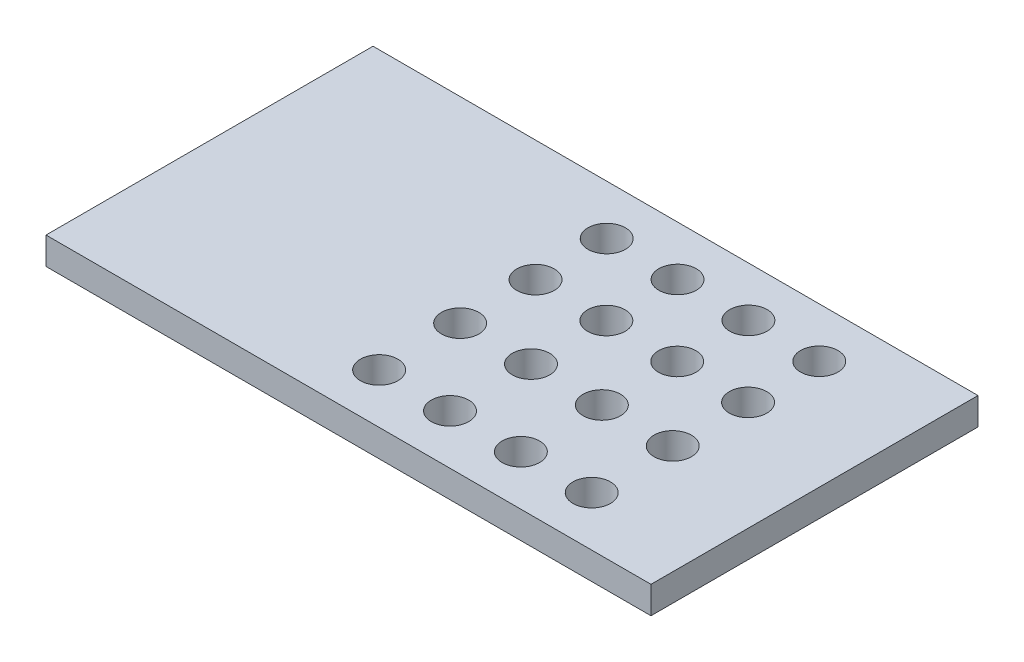
ISO-10303-21;
HEADER;
FILE_DESCRIPTION(('STEP AP214'),'2;1');
FILE_NAME('part.step','',(''),(''),'','','');
FILE_SCHEMA(('AUTOMOTIVE_DESIGN { 1 0 10303 214 1 1 1 1 }'));
ENDSEC;
DATA;
#1=APPLICATION_CONTEXT('core data for automotive mechanical design processes');
#2=APPLICATION_PROTOCOL_DEFINITION('international standard','automotive_design',2000,#1);
#3=PRODUCT_CONTEXT('',#1,'mechanical');
#4=PRODUCT('Part','Part','',(#3));
#5=PRODUCT_RELATED_PRODUCT_CATEGORY('part','',(#4));
#6=PRODUCT_DEFINITION_FORMATION('','',#4);
#7=PRODUCT_DEFINITION_CONTEXT('part definition',#1,'design');
#8=PRODUCT_DEFINITION('design','',#6,#7);
#9=PRODUCT_DEFINITION_SHAPE('','',#8);
#10=(LENGTH_UNIT() NAMED_UNIT(*) SI_UNIT(.MILLI.,.METRE.));
#11=(NAMED_UNIT(*) PLANE_ANGLE_UNIT() SI_UNIT($,.RADIAN.));
#12=(NAMED_UNIT(*) SI_UNIT($,.STERADIAN.) SOLID_ANGLE_UNIT());
#13=UNCERTAINTY_MEASURE_WITH_UNIT(LENGTH_MEASURE(1.E-05),#10,'distance_accuracy_value','');
#14=(GEOMETRIC_REPRESENTATION_CONTEXT(3) GLOBAL_UNCERTAINTY_ASSIGNED_CONTEXT((#13)) GLOBAL_UNIT_ASSIGNED_CONTEXT((#10,
#11,#12)) REPRESENTATION_CONTEXT('',''));
#15=CARTESIAN_POINT('',(0.,0.,0.));
#16=DIRECTION('',(0.,0.,1.));
#17=DIRECTION('',(1.,0.,0.));
#18=AXIS2_PLACEMENT_3D('',#15,#16,#17);
#19=CARTESIAN_POINT('',(0.,6.35,0.));
#20=DIRECTION('',(0.,1.,0.));
#21=DIRECTION('',(0.,0.,1.));
#22=AXIS2_PLACEMENT_3D('',#19,#20,#21);
#23=PLANE('',#22);
#24=CARTESIAN_POINT('',(-8.255,6.35,27.65552));
#25=DIRECTION('',(0.,1.,0.));
#26=DIRECTION('',(0.,0.,1.));
#27=AXIS2_PLACEMENT_3D('',#24,#25,#26);
#28=CIRCLE('',#27,4.365625);
#29=CARTESIAN_POINT('',(-8.255,6.35,32.021145));
#30=VERTEX_POINT('',#29);
#31=EDGE_CURVE('E195',#30,#30,#28,.T.);
#32=ORIENTED_EDGE('',*,*,#31,.F.);
#33=EDGE_LOOP('',(#32));
#34=FACE_BOUND('',#33,.T.);
#35=CARTESIAN_POINT('',(24.765,6.35,27.65552));
#36=DIRECTION('',(0.,1.,0.));
#37=DIRECTION('',(0.,0.,1.));
#38=AXIS2_PLACEMENT_3D('',#35,#36,#37);
#39=CIRCLE('',#38,4.365625);
#40=CARTESIAN_POINT('',(24.765,6.35,32.021145));
#41=VERTEX_POINT('',#40);
#42=EDGE_CURVE('E183',#41,#41,#39,.T.);
#43=ORIENTED_EDGE('',*,*,#42,.F.);
#44=EDGE_LOOP('',(#43));
#45=FACE_BOUND('',#44,.T.);
#46=CARTESIAN_POINT('',(8.255,6.35,8.78078));
#47=DIRECTION('',(0.,1.,0.));
#48=DIRECTION('',(0.,0.,1.));
#49=AXIS2_PLACEMENT_3D('',#46,#47,#48);
#50=CIRCLE('',#49,4.365625);
#51=CARTESIAN_POINT('',(8.255,6.35,13.146405));
#52=VERTEX_POINT('',#51);
#53=EDGE_CURVE('E171',#52,#52,#50,.T.);
#54=ORIENTED_EDGE('',*,*,#53,.F.);
#55=EDGE_LOOP('',(#54));
#56=FACE_BOUND('',#55,.T.);
#57=CARTESIAN_POINT('',(-24.765,6.35,8.78078));
#58=DIRECTION('',(0.,1.,0.));
#59=DIRECTION('',(0.,0.,1.));
#60=AXIS2_PLACEMENT_3D('',#57,#58,#59);
#61=CIRCLE('',#60,4.365625);
#62=CARTESIAN_POINT('',(-24.765,6.35,13.146405));
#63=VERTEX_POINT('',#62);
#64=EDGE_CURVE('E159',#63,#63,#61,.T.);
#65=ORIENTED_EDGE('',*,*,#64,.F.);
#66=EDGE_LOOP('',(#65));
#67=FACE_BOUND('',#66,.T.);
#68=CARTESIAN_POINT('',(-8.255,6.35,-8.78078));
#69=DIRECTION('',(0.,1.,0.));
#70=DIRECTION('',(0.,0.,1.));
#71=AXIS2_PLACEMENT_3D('',#68,#69,#70);
#72=CIRCLE('',#71,4.365625);
#73=CARTESIAN_POINT('',(-8.255,6.35,-4.415155));
#74=VERTEX_POINT('',#73);
#75=EDGE_CURVE('E147',#74,#74,#72,.T.);
#76=ORIENTED_EDGE('',*,*,#75,.F.);
#77=EDGE_LOOP('',(#76));
#78=FACE_BOUND('',#77,.T.);
#79=CARTESIAN_POINT('',(24.765,6.35,-8.78078000000001));
#80=DIRECTION('',(0.,1.,0.));
#81=DIRECTION('',(0.,0.,1.));
#82=AXIS2_PLACEMENT_3D('',#79,#80,#81);
#83=CIRCLE('',#82,4.365625);
#84=CARTESIAN_POINT('',(24.765,6.35,-4.41515500000001));
#85=VERTEX_POINT('',#84);
#86=EDGE_CURVE('E135',#85,#85,#83,.T.);
#87=ORIENTED_EDGE('',*,*,#86,.F.);
#88=EDGE_LOOP('',(#87));
#89=FACE_BOUND('',#88,.T.);
#90=CARTESIAN_POINT('',(8.255,6.35,-25.36698));
#91=DIRECTION('',(0.,1.,0.));
#92=DIRECTION('',(0.,0.,1.));
#93=AXIS2_PLACEMENT_3D('',#90,#91,#92);
#94=CIRCLE('',#93,4.365625);
#95=CARTESIAN_POINT('',(8.255,6.35,-21.001355));
#96=VERTEX_POINT('',#95);
#97=EDGE_CURVE('E123',#96,#96,#94,.T.);
#98=ORIENTED_EDGE('',*,*,#97,.F.);
#99=EDGE_LOOP('',(#98));
#100=FACE_BOUND('',#99,.T.);
#101=CARTESIAN_POINT('',(-24.765,6.35,-25.36698));
#102=DIRECTION('',(0.,1.,0.));
#103=DIRECTION('',(0.,0.,1.));
#104=AXIS2_PLACEMENT_3D('',#101,#102,#103);
#105=CIRCLE('',#104,4.365625);
#106=CARTESIAN_POINT('',(-24.765,6.35,-21.001355));
#107=VERTEX_POINT('',#106);
#108=EDGE_CURVE('E102',#107,#107,#105,.T.);
#109=ORIENTED_EDGE('',*,*,#108,.F.);
#110=EDGE_LOOP('',(#109));
#111=FACE_BOUND('',#110,.T.);
#112=DIRECTION('',(0.,0.,1.));
#113=VECTOR('',#112,1.);
#114=CARTESIAN_POINT('',(-90.805,6.35,39.24427));
#115=LINE('',#114,#113);
#116=CARTESIAN_POINT('',(-90.805,6.35,-36.95573));
#117=VERTEX_POINT('',#116);
#118=CARTESIAN_POINT('',(-90.805,6.35,39.24427));
#119=VERTEX_POINT('',#118);
#120=EDGE_CURVE('E87',#117,#119,#115,.T.);
#121=ORIENTED_EDGE('',*,*,#120,.T.);
#122=DIRECTION('',(1.,0.,0.));
#123=VECTOR('',#122,1.);
#124=CARTESIAN_POINT('',(50.165,6.35,39.24427));
#125=LINE('',#124,#123);
#126=CARTESIAN_POINT('',(50.165,6.35,39.24427));
#127=VERTEX_POINT('',#126);
#128=EDGE_CURVE('E82',#119,#127,#125,.T.);
#129=ORIENTED_EDGE('',*,*,#128,.T.);
#130=DIRECTION('',(0.,0.,-1.));
#131=VECTOR('',#130,1.);
#132=CARTESIAN_POINT('',(50.165,6.35,39.24427));
#133=LINE('',#132,#131);
#134=CARTESIAN_POINT('',(50.165,6.35,-36.95573));
#135=VERTEX_POINT('',#134);
#136=EDGE_CURVE('E85',#127,#135,#133,.T.);
#137=ORIENTED_EDGE('',*,*,#136,.T.);
#138=DIRECTION('',(-1.,0.,0.));
#139=VECTOR('',#138,1.);
#140=CARTESIAN_POINT('',(50.165,6.35,-36.95573));
#141=LINE('',#140,#139);
#142=EDGE_CURVE('E52',#135,#117,#141,.T.);
#143=ORIENTED_EDGE('',*,*,#142,.T.);
#144=EDGE_LOOP('',(#121,#129,#137,#143));
#145=FACE_BOUND('',#144,.T.);
#146=CARTESIAN_POINT('',(-8.25500000000001,6.35,-25.36698));
#147=DIRECTION('',(0.,1.,0.));
#148=DIRECTION('',(0.,0.,1.));
#149=AXIS2_PLACEMENT_3D('',#146,#147,#148);
#150=CIRCLE('',#149,4.365625);
#151=CARTESIAN_POINT('',(-8.25500000000001,6.35,-21.001355));
#152=VERTEX_POINT('',#151);
#153=EDGE_CURVE('E117',#152,#152,#150,.T.);
#154=ORIENTED_EDGE('',*,*,#153,.F.);
#155=EDGE_LOOP('',(#154));
#156=FACE_BOUND('',#155,.T.);
#157=CARTESIAN_POINT('',(24.765,6.35,-25.36698));
#158=DIRECTION('',(0.,1.,0.));
#159=DIRECTION('',(0.,0.,1.));
#160=AXIS2_PLACEMENT_3D('',#157,#158,#159);
#161=CIRCLE('',#160,4.365625);
#162=CARTESIAN_POINT('',(24.765,6.35,-21.001355));
#163=VERTEX_POINT('',#162);
#164=EDGE_CURVE('E129',#163,#163,#161,.T.);
#165=ORIENTED_EDGE('',*,*,#164,.F.);
#166=EDGE_LOOP('',(#165));
#167=FACE_BOUND('',#166,.T.);
#168=CARTESIAN_POINT('',(8.255,6.35,-8.78078));
#169=DIRECTION('',(0.,1.,0.));
#170=DIRECTION('',(0.,0.,1.));
#171=AXIS2_PLACEMENT_3D('',#168,#169,#170);
#172=CIRCLE('',#171,4.365625);
#173=CARTESIAN_POINT('',(8.255,6.35,-4.415155));
#174=VERTEX_POINT('',#173);
#175=EDGE_CURVE('E141',#174,#174,#172,.T.);
#176=ORIENTED_EDGE('',*,*,#175,.F.);
#177=EDGE_LOOP('',(#176));
#178=FACE_BOUND('',#177,.T.);
#179=CARTESIAN_POINT('',(-24.765,6.35,-8.78078));
#180=DIRECTION('',(0.,1.,0.));
#181=DIRECTION('',(0.,0.,1.));
#182=AXIS2_PLACEMENT_3D('',#179,#180,#181);
#183=CIRCLE('',#182,4.365625);
#184=CARTESIAN_POINT('',(-24.765,6.35,-4.415155));
#185=VERTEX_POINT('',#184);
#186=EDGE_CURVE('E153',#185,#185,#183,.T.);
#187=ORIENTED_EDGE('',*,*,#186,.F.);
#188=EDGE_LOOP('',(#187));
#189=FACE_BOUND('',#188,.T.);
#190=CARTESIAN_POINT('',(-8.25500000000001,6.35,8.78078));
#191=DIRECTION('',(0.,1.,0.));
#192=DIRECTION('',(0.,0.,1.));
#193=AXIS2_PLACEMENT_3D('',#190,#191,#192);
#194=CIRCLE('',#193,4.365625);
#195=CARTESIAN_POINT('',(-8.25500000000001,6.35,13.146405));
#196=VERTEX_POINT('',#195);
#197=EDGE_CURVE('E165',#196,#196,#194,.T.);
#198=ORIENTED_EDGE('',*,*,#197,.F.);
#199=EDGE_LOOP('',(#198));
#200=FACE_BOUND('',#199,.T.);
#201=CARTESIAN_POINT('',(24.765,6.35,8.78077999999999));
#202=DIRECTION('',(0.,1.,0.));
#203=DIRECTION('',(0.,0.,1.));
#204=AXIS2_PLACEMENT_3D('',#201,#202,#203);
#205=CIRCLE('',#204,4.365625);
#206=CARTESIAN_POINT('',(24.765,6.35,13.146405));
#207=VERTEX_POINT('',#206);
#208=EDGE_CURVE('E177',#207,#207,#205,.T.);
#209=ORIENTED_EDGE('',*,*,#208,.F.);
#210=EDGE_LOOP('',(#209));
#211=FACE_BOUND('',#210,.T.);
#212=CARTESIAN_POINT('',(8.255,6.35,27.65552));
#213=DIRECTION('',(0.,1.,0.));
#214=DIRECTION('',(0.,0.,1.));
#215=AXIS2_PLACEMENT_3D('',#212,#213,#214);
#216=CIRCLE('',#215,4.365625);
#217=CARTESIAN_POINT('',(8.255,6.35,32.021145));
#218=VERTEX_POINT('',#217);
#219=EDGE_CURVE('E189',#218,#218,#216,.T.);
#220=ORIENTED_EDGE('',*,*,#219,.F.);
#221=EDGE_LOOP('',(#220));
#222=FACE_BOUND('',#221,.T.);
#223=CARTESIAN_POINT('',(-24.765,6.35,27.65552));
#224=DIRECTION('',(0.,1.,0.));
#225=DIRECTION('',(0.,0.,1.));
#226=AXIS2_PLACEMENT_3D('',#223,#224,#225);
#227=CIRCLE('',#226,4.365625);
#228=CARTESIAN_POINT('',(-24.765,6.35,32.021145));
#229=VERTEX_POINT('',#228);
#230=EDGE_CURVE('E201',#229,#229,#227,.T.);
#231=ORIENTED_EDGE('',*,*,#230,.F.);
#232=EDGE_LOOP('',(#231));
#233=FACE_BOUND('',#232,.T.);
#234=ADVANCED_FACE('F35',(#34,#45,#56,#67,#78,#89,#100,#111,#145,#156,#167,#178,#189,#200,#211,
#222,#233),#23,.T.);
#235=CARTESIAN_POINT('',(0.,0.,0.));
#236=DIRECTION('',(0.,1.,0.));
#237=DIRECTION('',(0.,0.,1.));
#238=AXIS2_PLACEMENT_3D('',#235,#236,#237);
#239=PLANE('',#238);
#240=DIRECTION('',(0.,0.,1.));
#241=VECTOR('',#240,1.);
#242=CARTESIAN_POINT('',(-90.805,0.,39.24427));
#243=LINE('',#242,#241);
#244=CARTESIAN_POINT('',(-90.805,0.,-36.95573));
#245=VERTEX_POINT('',#244);
#246=CARTESIAN_POINT('',(-90.805,0.,39.24427));
#247=VERTEX_POINT('',#246);
#248=EDGE_CURVE('E99',#245,#247,#243,.T.);
#249=ORIENTED_EDGE('',*,*,#248,.F.);
#250=DIRECTION('',(-1.,0.,0.));
#251=VECTOR('',#250,1.);
#252=CARTESIAN_POINT('',(50.165,0.,-36.95573));
#253=LINE('',#252,#251);
#254=CARTESIAN_POINT('',(50.165,0.,-36.95573));
#255=VERTEX_POINT('',#254);
#256=EDGE_CURVE('E75',#255,#245,#253,.T.);
#257=ORIENTED_EDGE('',*,*,#256,.F.);
#258=DIRECTION('',(0.,0.,-1.));
#259=VECTOR('',#258,1.);
#260=CARTESIAN_POINT('',(50.165,0.,39.24427));
#261=LINE('',#260,#259);
#262=CARTESIAN_POINT('',(50.165,0.,39.24427));
#263=VERTEX_POINT('',#262);
#264=EDGE_CURVE('E69',#263,#255,#261,.T.);
#265=ORIENTED_EDGE('',*,*,#264,.F.);
#266=DIRECTION('',(1.,0.,0.));
#267=VECTOR('',#266,1.);
#268=CARTESIAN_POINT('',(50.165,0.,39.24427));
#269=LINE('',#268,#267);
#270=EDGE_CURVE('E91',#247,#263,#269,.T.);
#271=ORIENTED_EDGE('',*,*,#270,.F.);
#272=EDGE_LOOP('',(#249,#257,#265,#271));
#273=FACE_BOUND('',#272,.T.);
#274=CARTESIAN_POINT('',(-24.765,0.,-25.36698));
#275=DIRECTION('',(0.,1.,0.));
#276=DIRECTION('',(0.,0.,1.));
#277=AXIS2_PLACEMENT_3D('',#274,#275,#276);
#278=CIRCLE('',#277,4.365625);
#279=CARTESIAN_POINT('',(-24.765,0.,-21.001355));
#280=VERTEX_POINT('',#279);
#281=EDGE_CURVE('E114',#280,#280,#278,.T.);
#282=ORIENTED_EDGE('',*,*,#281,.T.);
#283=EDGE_LOOP('',(#282));
#284=FACE_BOUND('',#283,.T.);
#285=CARTESIAN_POINT('',(-8.25500000000001,0.,-25.36698));
#286=DIRECTION('',(0.,1.,0.));
#287=DIRECTION('',(0.,0.,1.));
#288=AXIS2_PLACEMENT_3D('',#285,#286,#287);
#289=CIRCLE('',#288,4.365625);
#290=CARTESIAN_POINT('',(-8.25500000000001,0.,-21.001355));
#291=VERTEX_POINT('',#290);
#292=EDGE_CURVE('E120',#291,#291,#289,.T.);
#293=ORIENTED_EDGE('',*,*,#292,.T.);
#294=EDGE_LOOP('',(#293));
#295=FACE_BOUND('',#294,.T.);
#296=CARTESIAN_POINT('',(8.255,0.,-25.36698));
#297=DIRECTION('',(0.,1.,0.));
#298=DIRECTION('',(0.,0.,1.));
#299=AXIS2_PLACEMENT_3D('',#296,#297,#298);
#300=CIRCLE('',#299,4.365625);
#301=CARTESIAN_POINT('',(8.255,0.,-21.001355));
#302=VERTEX_POINT('',#301);
#303=EDGE_CURVE('E126',#302,#302,#300,.T.);
#304=ORIENTED_EDGE('',*,*,#303,.T.);
#305=EDGE_LOOP('',(#304));
#306=FACE_BOUND('',#305,.T.);
#307=CARTESIAN_POINT('',(24.765,0.,-25.36698));
#308=DIRECTION('',(0.,1.,0.));
#309=DIRECTION('',(0.,0.,1.));
#310=AXIS2_PLACEMENT_3D('',#307,#308,#309);
#311=CIRCLE('',#310,4.365625);
#312=CARTESIAN_POINT('',(24.765,0.,-21.001355));
#313=VERTEX_POINT('',#312);
#314=EDGE_CURVE('E132',#313,#313,#311,.T.);
#315=ORIENTED_EDGE('',*,*,#314,.T.);
#316=EDGE_LOOP('',(#315));
#317=FACE_BOUND('',#316,.T.);
#318=CARTESIAN_POINT('',(24.765,0.,-8.78078000000001));
#319=DIRECTION('',(0.,1.,0.));
#320=DIRECTION('',(0.,0.,1.));
#321=AXIS2_PLACEMENT_3D('',#318,#319,#320);
#322=CIRCLE('',#321,4.365625);
#323=CARTESIAN_POINT('',(24.765,0.,-4.41515500000001));
#324=VERTEX_POINT('',#323);
#325=EDGE_CURVE('E138',#324,#324,#322,.T.);
#326=ORIENTED_EDGE('',*,*,#325,.T.);
#327=EDGE_LOOP('',(#326));
#328=FACE_BOUND('',#327,.T.);
#329=CARTESIAN_POINT('',(8.255,0.,-8.78078));
#330=DIRECTION('',(0.,1.,0.));
#331=DIRECTION('',(0.,0.,1.));
#332=AXIS2_PLACEMENT_3D('',#329,#330,#331);
#333=CIRCLE('',#332,4.365625);
#334=CARTESIAN_POINT('',(8.255,0.,-4.415155));
#335=VERTEX_POINT('',#334);
#336=EDGE_CURVE('E144',#335,#335,#333,.T.);
#337=ORIENTED_EDGE('',*,*,#336,.T.);
#338=EDGE_LOOP('',(#337));
#339=FACE_BOUND('',#338,.T.);
#340=CARTESIAN_POINT('',(-8.255,0.,-8.78078));
#341=DIRECTION('',(0.,1.,0.));
#342=DIRECTION('',(0.,0.,1.));
#343=AXIS2_PLACEMENT_3D('',#340,#341,#342);
#344=CIRCLE('',#343,4.365625);
#345=CARTESIAN_POINT('',(-8.255,0.,-4.415155));
#346=VERTEX_POINT('',#345);
#347=EDGE_CURVE('E150',#346,#346,#344,.T.);
#348=ORIENTED_EDGE('',*,*,#347,.T.);
#349=EDGE_LOOP('',(#348));
#350=FACE_BOUND('',#349,.T.);
#351=CARTESIAN_POINT('',(-24.765,0.,-8.78078));
#352=DIRECTION('',(0.,1.,0.));
#353=DIRECTION('',(0.,0.,1.));
#354=AXIS2_PLACEMENT_3D('',#351,#352,#353);
#355=CIRCLE('',#354,4.365625);
#356=CARTESIAN_POINT('',(-24.765,0.,-4.415155));
#357=VERTEX_POINT('',#356);
#358=EDGE_CURVE('E156',#357,#357,#355,.T.);
#359=ORIENTED_EDGE('',*,*,#358,.T.);
#360=EDGE_LOOP('',(#359));
#361=FACE_BOUND('',#360,.T.);
#362=CARTESIAN_POINT('',(-24.765,0.,8.78078));
#363=DIRECTION('',(0.,1.,0.));
#364=DIRECTION('',(0.,0.,1.));
#365=AXIS2_PLACEMENT_3D('',#362,#363,#364);
#366=CIRCLE('',#365,4.365625);
#367=CARTESIAN_POINT('',(-24.765,0.,13.146405));
#368=VERTEX_POINT('',#367);
#369=EDGE_CURVE('E162',#368,#368,#366,.T.);
#370=ORIENTED_EDGE('',*,*,#369,.T.);
#371=EDGE_LOOP('',(#370));
#372=FACE_BOUND('',#371,.T.);
#373=CARTESIAN_POINT('',(-8.25500000000001,0.,8.78078));
#374=DIRECTION('',(0.,1.,0.));
#375=DIRECTION('',(0.,0.,1.));
#376=AXIS2_PLACEMENT_3D('',#373,#374,#375);
#377=CIRCLE('',#376,4.365625);
#378=CARTESIAN_POINT('',(-8.25500000000001,0.,13.146405));
#379=VERTEX_POINT('',#378);
#380=EDGE_CURVE('E168',#379,#379,#377,.T.);
#381=ORIENTED_EDGE('',*,*,#380,.T.);
#382=EDGE_LOOP('',(#381));
#383=FACE_BOUND('',#382,.T.);
#384=CARTESIAN_POINT('',(8.255,0.,8.78078));
#385=DIRECTION('',(0.,1.,0.));
#386=DIRECTION('',(0.,0.,1.));
#387=AXIS2_PLACEMENT_3D('',#384,#385,#386);
#388=CIRCLE('',#387,4.365625);
#389=CARTESIAN_POINT('',(8.255,0.,13.146405));
#390=VERTEX_POINT('',#389);
#391=EDGE_CURVE('E174',#390,#390,#388,.T.);
#392=ORIENTED_EDGE('',*,*,#391,.T.);
#393=EDGE_LOOP('',(#392));
#394=FACE_BOUND('',#393,.T.);
#395=CARTESIAN_POINT('',(24.765,0.,8.78077999999999));
#396=DIRECTION('',(0.,1.,0.));
#397=DIRECTION('',(0.,0.,1.));
#398=AXIS2_PLACEMENT_3D('',#395,#396,#397);
#399=CIRCLE('',#398,4.365625);
#400=CARTESIAN_POINT('',(24.765,0.,13.146405));
#401=VERTEX_POINT('',#400);
#402=EDGE_CURVE('E180',#401,#401,#399,.T.);
#403=ORIENTED_EDGE('',*,*,#402,.T.);
#404=EDGE_LOOP('',(#403));
#405=FACE_BOUND('',#404,.T.);
#406=CARTESIAN_POINT('',(24.765,0.,27.65552));
#407=DIRECTION('',(0.,1.,0.));
#408=DIRECTION('',(0.,0.,1.));
#409=AXIS2_PLACEMENT_3D('',#406,#407,#408);
#410=CIRCLE('',#409,4.365625);
#411=CARTESIAN_POINT('',(24.765,0.,32.021145));
#412=VERTEX_POINT('',#411);
#413=EDGE_CURVE('E186',#412,#412,#410,.T.);
#414=ORIENTED_EDGE('',*,*,#413,.T.);
#415=EDGE_LOOP('',(#414));
#416=FACE_BOUND('',#415,.T.);
#417=CARTESIAN_POINT('',(8.255,0.,27.65552));
#418=DIRECTION('',(0.,1.,0.));
#419=DIRECTION('',(0.,0.,1.));
#420=AXIS2_PLACEMENT_3D('',#417,#418,#419);
#421=CIRCLE('',#420,4.365625);
#422=CARTESIAN_POINT('',(8.255,0.,32.021145));
#423=VERTEX_POINT('',#422);
#424=EDGE_CURVE('E192',#423,#423,#421,.T.);
#425=ORIENTED_EDGE('',*,*,#424,.T.);
#426=EDGE_LOOP('',(#425));
#427=FACE_BOUND('',#426,.T.);
#428=CARTESIAN_POINT('',(-8.255,0.,27.65552));
#429=DIRECTION('',(0.,1.,0.));
#430=DIRECTION('',(0.,0.,1.));
#431=AXIS2_PLACEMENT_3D('',#428,#429,#430);
#432=CIRCLE('',#431,4.365625);
#433=CARTESIAN_POINT('',(-8.255,0.,32.021145));
#434=VERTEX_POINT('',#433);
#435=EDGE_CURVE('E198',#434,#434,#432,.T.);
#436=ORIENTED_EDGE('',*,*,#435,.T.);
#437=EDGE_LOOP('',(#436));
#438=FACE_BOUND('',#437,.T.);
#439=CARTESIAN_POINT('',(-24.765,0.,27.65552));
#440=DIRECTION('',(0.,1.,0.));
#441=DIRECTION('',(0.,0.,1.));
#442=AXIS2_PLACEMENT_3D('',#439,#440,#441);
#443=CIRCLE('',#442,4.365625);
#444=CARTESIAN_POINT('',(-24.765,0.,32.021145));
#445=VERTEX_POINT('',#444);
#446=EDGE_CURVE('E204',#445,#445,#443,.T.);
#447=ORIENTED_EDGE('',*,*,#446,.T.);
#448=EDGE_LOOP('',(#447));
#449=FACE_BOUND('',#448,.T.);
#450=ADVANCED_FACE('F110',(#273,#284,#295,#306,#317,#328,#339,#350,#361,#372,#383,#394,#405,
#416,#427,#438,#449),#239,.F.);
#451=CARTESIAN_POINT('',(-90.805,6.35,39.24427));
#452=DIRECTION('',(1.,0.,0.));
#453=DIRECTION('',(0.,0.,-1.));
#454=AXIS2_PLACEMENT_3D('',#451,#452,#453);
#455=PLANE('',#454);
#456=ORIENTED_EDGE('',*,*,#248,.T.);
#457=DIRECTION('',(0.,-1.,0.));
#458=VECTOR('',#457,1.);
#459=CARTESIAN_POINT('',(-90.805,6.35,39.24427));
#460=LINE('',#459,#458);
#461=EDGE_CURVE('E11',#119,#247,#460,.T.);
#462=ORIENTED_EDGE('',*,*,#461,.F.);
#463=ORIENTED_EDGE('',*,*,#120,.F.);
#464=DIRECTION('',(0.,-1.,0.));
#465=VECTOR('',#464,1.);
#466=CARTESIAN_POINT('',(-90.805,6.35,-36.95573));
#467=LINE('',#466,#465);
#468=EDGE_CURVE('E95',#117,#245,#467,.T.);
#469=ORIENTED_EDGE('',*,*,#468,.T.);
#470=EDGE_LOOP('',(#456,#462,#463,#469));
#471=FACE_BOUND('',#470,.T.);
#472=ADVANCED_FACE('F37',(#471),#455,.F.);
#473=CARTESIAN_POINT('',(50.165,6.35,39.24427));
#474=DIRECTION('',(0.,0.,-1.));
#475=DIRECTION('',(-1.,0.,0.));
#476=AXIS2_PLACEMENT_3D('',#473,#474,#475);
#477=PLANE('',#476);
#478=ORIENTED_EDGE('',*,*,#270,.T.);
#479=DIRECTION('',(0.,-1.,0.));
#480=VECTOR('',#479,1.);
#481=CARTESIAN_POINT('',(50.165,6.35,39.24427));
#482=LINE('',#481,#480);
#483=EDGE_CURVE('E44',#127,#263,#482,.T.);
#484=ORIENTED_EDGE('',*,*,#483,.F.);
#485=ORIENTED_EDGE('',*,*,#128,.F.);
#486=ORIENTED_EDGE('',*,*,#461,.T.);
#487=EDGE_LOOP('',(#478,#484,#485,#486));
#488=FACE_BOUND('',#487,.T.);
#489=ADVANCED_FACE('F90',(#488),#477,.F.);
#490=CARTESIAN_POINT('',(50.165,6.35,39.24427));
#491=DIRECTION('',(-1.,0.,0.));
#492=DIRECTION('',(0.,0.,1.));
#493=AXIS2_PLACEMENT_3D('',#490,#491,#492);
#494=PLANE('',#493);
#495=ORIENTED_EDGE('',*,*,#264,.T.);
#496=DIRECTION('',(0.,-1.,0.));
#497=VECTOR('',#496,1.);
#498=CARTESIAN_POINT('',(50.165,6.35,-36.95573));
#499=LINE('',#498,#497);
#500=EDGE_CURVE('E92',#135,#255,#499,.T.);
#501=ORIENTED_EDGE('',*,*,#500,.F.);
#502=ORIENTED_EDGE('',*,*,#136,.F.);
#503=ORIENTED_EDGE('',*,*,#483,.T.);
#504=EDGE_LOOP('',(#495,#501,#502,#503));
#505=FACE_BOUND('',#504,.T.);
#506=ADVANCED_FACE('F93',(#505),#494,.F.);
#507=CARTESIAN_POINT('',(50.165,6.35,-36.95573));
#508=DIRECTION('',(0.,0.,1.));
#509=DIRECTION('',(1.,0.,0.));
#510=AXIS2_PLACEMENT_3D('',#507,#508,#509);
#511=PLANE('',#510);
#512=ORIENTED_EDGE('',*,*,#256,.T.);
#513=ORIENTED_EDGE('',*,*,#468,.F.);
#514=ORIENTED_EDGE('',*,*,#142,.F.);
#515=ORIENTED_EDGE('',*,*,#500,.T.);
#516=EDGE_LOOP('',(#512,#513,#514,#515));
#517=FACE_BOUND('',#516,.T.);
#518=ADVANCED_FACE('F107',(#517),#511,.F.);
#519=CARTESIAN_POINT('',(-24.765,6.35,-25.36698));
#520=DIRECTION('',(0.,-1.,0.));
#521=DIRECTION('',(0.,0.,-1.));
#522=AXIS2_PLACEMENT_3D('',#519,#520,#521);
#523=CYLINDRICAL_SURFACE('',#522,4.365625);
#524=ORIENTED_EDGE('',*,*,#108,.T.);
#525=EDGE_LOOP('',(#524));
#526=FACE_BOUND('',#525,.T.);
#527=ORIENTED_EDGE('',*,*,#281,.F.);
#528=EDGE_LOOP('',(#527));
#529=FACE_BOUND('',#528,.T.);
#530=ADVANCED_FACE('F223',(#526,#529),#523,.F.);
#531=CARTESIAN_POINT('',(-8.25500000000001,6.35,-25.36698));
#532=DIRECTION('',(0.,-1.,0.));
#533=DIRECTION('',(0.,0.,-1.));
#534=AXIS2_PLACEMENT_3D('',#531,#532,#533);
#535=CYLINDRICAL_SURFACE('',#534,4.365625);
#536=ORIENTED_EDGE('',*,*,#153,.T.);
#537=EDGE_LOOP('',(#536));
#538=FACE_BOUND('',#537,.T.);
#539=ORIENTED_EDGE('',*,*,#292,.F.);
#540=EDGE_LOOP('',(#539));
#541=FACE_BOUND('',#540,.T.);
#542=ADVANCED_FACE('F269',(#538,#541),#535,.F.);
#543=CARTESIAN_POINT('',(8.255,6.35,-25.36698));
#544=DIRECTION('',(0.,-1.,0.));
#545=DIRECTION('',(0.,0.,-1.));
#546=AXIS2_PLACEMENT_3D('',#543,#544,#545);
#547=CYLINDRICAL_SURFACE('',#546,4.365625);
#548=ORIENTED_EDGE('',*,*,#97,.T.);
#549=EDGE_LOOP('',(#548));
#550=FACE_BOUND('',#549,.T.);
#551=ORIENTED_EDGE('',*,*,#303,.F.);
#552=EDGE_LOOP('',(#551));
#553=FACE_BOUND('',#552,.T.);
#554=ADVANCED_FACE('F277',(#550,#553),#547,.F.);
#555=CARTESIAN_POINT('',(24.765,6.35,-25.36698));
#556=DIRECTION('',(0.,-1.,0.));
#557=DIRECTION('',(0.,0.,-1.));
#558=AXIS2_PLACEMENT_3D('',#555,#556,#557);
#559=CYLINDRICAL_SURFACE('',#558,4.365625);
#560=ORIENTED_EDGE('',*,*,#164,.T.);
#561=EDGE_LOOP('',(#560));
#562=FACE_BOUND('',#561,.T.);
#563=ORIENTED_EDGE('',*,*,#314,.F.);
#564=EDGE_LOOP('',(#563));
#565=FACE_BOUND('',#564,.T.);
#566=ADVANCED_FACE('F285',(#562,#565),#559,.F.);
#567=CARTESIAN_POINT('',(24.765,6.35,-8.78078000000001));
#568=DIRECTION('',(0.,-1.,0.));
#569=DIRECTION('',(0.,0.,-1.));
#570=AXIS2_PLACEMENT_3D('',#567,#568,#569);
#571=CYLINDRICAL_SURFACE('',#570,4.365625);
#572=ORIENTED_EDGE('',*,*,#86,.T.);
#573=EDGE_LOOP('',(#572));
#574=FACE_BOUND('',#573,.T.);
#575=ORIENTED_EDGE('',*,*,#325,.F.);
#576=EDGE_LOOP('',(#575));
#577=FACE_BOUND('',#576,.T.);
#578=ADVANCED_FACE('F294',(#574,#577),#571,.F.);
#579=CARTESIAN_POINT('',(8.255,6.35,-8.78078));
#580=DIRECTION('',(0.,-1.,0.));
#581=DIRECTION('',(0.,0.,-1.));
#582=AXIS2_PLACEMENT_3D('',#579,#580,#581);
#583=CYLINDRICAL_SURFACE('',#582,4.365625);
#584=ORIENTED_EDGE('',*,*,#175,.T.);
#585=EDGE_LOOP('',(#584));
#586=FACE_BOUND('',#585,.T.);
#587=ORIENTED_EDGE('',*,*,#336,.F.);
#588=EDGE_LOOP('',(#587));
#589=FACE_BOUND('',#588,.T.);
#590=ADVANCED_FACE('F303',(#586,#589),#583,.F.);
#591=CARTESIAN_POINT('',(-8.255,6.35,-8.78078));
#592=DIRECTION('',(0.,-1.,0.));
#593=DIRECTION('',(0.,0.,-1.));
#594=AXIS2_PLACEMENT_3D('',#591,#592,#593);
#595=CYLINDRICAL_SURFACE('',#594,4.365625);
#596=ORIENTED_EDGE('',*,*,#75,.T.);
#597=EDGE_LOOP('',(#596));
#598=FACE_BOUND('',#597,.T.);
#599=ORIENTED_EDGE('',*,*,#347,.F.);
#600=EDGE_LOOP('',(#599));
#601=FACE_BOUND('',#600,.T.);
#602=ADVANCED_FACE('F312',(#598,#601),#595,.F.);
#603=CARTESIAN_POINT('',(-24.765,6.35,-8.78078));
#604=DIRECTION('',(0.,-1.,0.));
#605=DIRECTION('',(0.,0.,-1.));
#606=AXIS2_PLACEMENT_3D('',#603,#604,#605);
#607=CYLINDRICAL_SURFACE('',#606,4.365625);
#608=ORIENTED_EDGE('',*,*,#186,.T.);
#609=EDGE_LOOP('',(#608));
#610=FACE_BOUND('',#609,.T.);
#611=ORIENTED_EDGE('',*,*,#358,.F.);
#612=EDGE_LOOP('',(#611));
#613=FACE_BOUND('',#612,.T.);
#614=ADVANCED_FACE('F321',(#610,#613),#607,.F.);
#615=CARTESIAN_POINT('',(-24.765,6.35,8.78078));
#616=DIRECTION('',(0.,-1.,0.));
#617=DIRECTION('',(0.,0.,-1.));
#618=AXIS2_PLACEMENT_3D('',#615,#616,#617);
#619=CYLINDRICAL_SURFACE('',#618,4.365625);
#620=ORIENTED_EDGE('',*,*,#64,.T.);
#621=EDGE_LOOP('',(#620));
#622=FACE_BOUND('',#621,.T.);
#623=ORIENTED_EDGE('',*,*,#369,.F.);
#624=EDGE_LOOP('',(#623));
#625=FACE_BOUND('',#624,.T.);
#626=ADVANCED_FACE('F330',(#622,#625),#619,.F.);
#627=CARTESIAN_POINT('',(-8.25500000000001,6.35,8.78078));
#628=DIRECTION('',(0.,-1.,0.));
#629=DIRECTION('',(0.,0.,-1.));
#630=AXIS2_PLACEMENT_3D('',#627,#628,#629);
#631=CYLINDRICAL_SURFACE('',#630,4.365625);
#632=ORIENTED_EDGE('',*,*,#197,.T.);
#633=EDGE_LOOP('',(#632));
#634=FACE_BOUND('',#633,.T.);
#635=ORIENTED_EDGE('',*,*,#380,.F.);
#636=EDGE_LOOP('',(#635));
#637=FACE_BOUND('',#636,.T.);
#638=ADVANCED_FACE('F339',(#634,#637),#631,.F.);
#639=CARTESIAN_POINT('',(8.255,6.35,8.78078));
#640=DIRECTION('',(0.,-1.,0.));
#641=DIRECTION('',(0.,0.,-1.));
#642=AXIS2_PLACEMENT_3D('',#639,#640,#641);
#643=CYLINDRICAL_SURFACE('',#642,4.365625);
#644=ORIENTED_EDGE('',*,*,#53,.T.);
#645=EDGE_LOOP('',(#644));
#646=FACE_BOUND('',#645,.T.);
#647=ORIENTED_EDGE('',*,*,#391,.F.);
#648=EDGE_LOOP('',(#647));
#649=FACE_BOUND('',#648,.T.);
#650=ADVANCED_FACE('F348',(#646,#649),#643,.F.);
#651=CARTESIAN_POINT('',(24.765,6.35,8.78077999999999));
#652=DIRECTION('',(0.,-1.,0.));
#653=DIRECTION('',(0.,0.,-1.));
#654=AXIS2_PLACEMENT_3D('',#651,#652,#653);
#655=CYLINDRICAL_SURFACE('',#654,4.365625);
#656=ORIENTED_EDGE('',*,*,#208,.T.);
#657=EDGE_LOOP('',(#656));
#658=FACE_BOUND('',#657,.T.);
#659=ORIENTED_EDGE('',*,*,#402,.F.);
#660=EDGE_LOOP('',(#659));
#661=FACE_BOUND('',#660,.T.);
#662=ADVANCED_FACE('F357',(#658,#661),#655,.F.);
#663=CARTESIAN_POINT('',(24.765,6.35,27.65552));
#664=DIRECTION('',(0.,-1.,0.));
#665=DIRECTION('',(0.,0.,-1.));
#666=AXIS2_PLACEMENT_3D('',#663,#664,#665);
#667=CYLINDRICAL_SURFACE('',#666,4.365625);
#668=ORIENTED_EDGE('',*,*,#42,.T.);
#669=EDGE_LOOP('',(#668));
#670=FACE_BOUND('',#669,.T.);
#671=ORIENTED_EDGE('',*,*,#413,.F.);
#672=EDGE_LOOP('',(#671));
#673=FACE_BOUND('',#672,.T.);
#674=ADVANCED_FACE('F366',(#670,#673),#667,.F.);
#675=CARTESIAN_POINT('',(8.255,6.35,27.65552));
#676=DIRECTION('',(0.,-1.,0.));
#677=DIRECTION('',(0.,0.,-1.));
#678=AXIS2_PLACEMENT_3D('',#675,#676,#677);
#679=CYLINDRICAL_SURFACE('',#678,4.365625);
#680=ORIENTED_EDGE('',*,*,#219,.T.);
#681=EDGE_LOOP('',(#680));
#682=FACE_BOUND('',#681,.T.);
#683=ORIENTED_EDGE('',*,*,#424,.F.);
#684=EDGE_LOOP('',(#683));
#685=FACE_BOUND('',#684,.T.);
#686=ADVANCED_FACE('F375',(#682,#685),#679,.F.);
#687=CARTESIAN_POINT('',(-8.255,6.35,27.65552));
#688=DIRECTION('',(0.,-1.,0.));
#689=DIRECTION('',(0.,0.,-1.));
#690=AXIS2_PLACEMENT_3D('',#687,#688,#689);
#691=CYLINDRICAL_SURFACE('',#690,4.365625);
#692=ORIENTED_EDGE('',*,*,#31,.T.);
#693=EDGE_LOOP('',(#692));
#694=FACE_BOUND('',#693,.T.);
#695=ORIENTED_EDGE('',*,*,#435,.F.);
#696=EDGE_LOOP('',(#695));
#697=FACE_BOUND('',#696,.T.);
#698=ADVANCED_FACE('F384',(#694,#697),#691,.F.);
#699=CARTESIAN_POINT('',(-24.765,6.35,27.65552));
#700=DIRECTION('',(0.,-1.,0.));
#701=DIRECTION('',(0.,0.,-1.));
#702=AXIS2_PLACEMENT_3D('',#699,#700,#701);
#703=CYLINDRICAL_SURFACE('',#702,4.365625);
#704=ORIENTED_EDGE('',*,*,#230,.T.);
#705=EDGE_LOOP('',(#704));
#706=FACE_BOUND('',#705,.T.);
#707=ORIENTED_EDGE('',*,*,#446,.F.);
#708=EDGE_LOOP('',(#707));
#709=FACE_BOUND('',#708,.T.);
#710=ADVANCED_FACE('F210',(#706,#709),#703,.F.);
#711=CLOSED_SHELL('',(#234,#450,#472,#489,#506,#518,#530,#542,#554,#566,#578,#590,#602,#614,
#626,#638,#650,#662,#674,#686,#698,#710));
#712=MANIFOLD_SOLID_BREP('B2',#711);
#713=ADVANCED_BREP_SHAPE_REPRESENTATION('',(#18,#712),#14);
#714=SHAPE_DEFINITION_REPRESENTATION(#9,#713);
ENDSEC;
END-ISO-10303-21;
